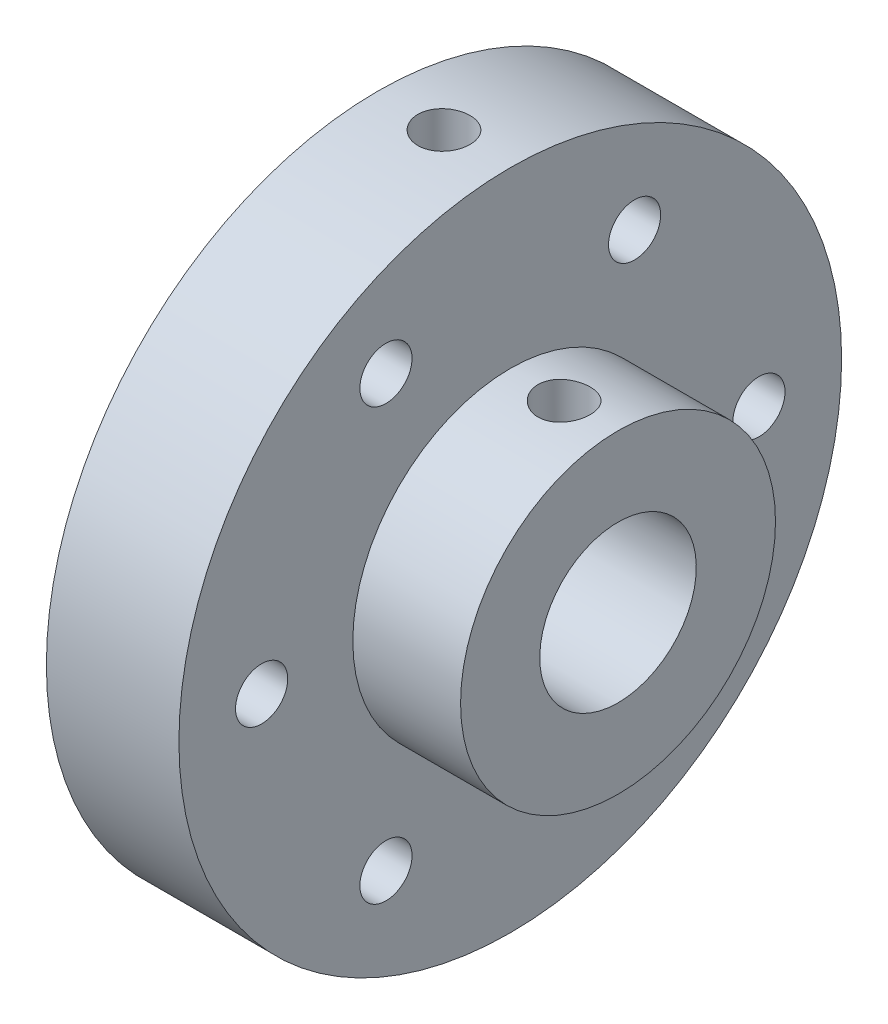
ISO-10303-21;
HEADER;
FILE_DESCRIPTION(('STEP AP214'),'2;1');
FILE_NAME('part.step','',(''),(''),'','','');
FILE_SCHEMA(('AUTOMOTIVE_DESIGN { 1 0 10303 214 1 1 1 1 }'));
ENDSEC;
DATA;
#1=APPLICATION_CONTEXT('core data for automotive mechanical design processes');
#2=APPLICATION_PROTOCOL_DEFINITION('international standard','automotive_design',2000,#1);
#3=PRODUCT_CONTEXT('',#1,'mechanical');
#4=PRODUCT('Part','Part','',(#3));
#5=PRODUCT_RELATED_PRODUCT_CATEGORY('part','',(#4));
#6=PRODUCT_DEFINITION_FORMATION('','',#4);
#7=PRODUCT_DEFINITION_CONTEXT('part definition',#1,'design');
#8=PRODUCT_DEFINITION('design','',#6,#7);
#9=PRODUCT_DEFINITION_SHAPE('','',#8);
#10=(LENGTH_UNIT() NAMED_UNIT(*) SI_UNIT(.MILLI.,.METRE.));
#11=(NAMED_UNIT(*) PLANE_ANGLE_UNIT() SI_UNIT($,.RADIAN.));
#12=(NAMED_UNIT(*) SI_UNIT($,.STERADIAN.) SOLID_ANGLE_UNIT());
#13=UNCERTAINTY_MEASURE_WITH_UNIT(LENGTH_MEASURE(1.E-05),#10,'distance_accuracy_value','');
#14=(GEOMETRIC_REPRESENTATION_CONTEXT(3) GLOBAL_UNCERTAINTY_ASSIGNED_CONTEXT((#13)) GLOBAL_UNIT_ASSIGNED_CONTEXT((#10,
#11,#12)) REPRESENTATION_CONTEXT('',''));
#15=CARTESIAN_POINT('',(0.,0.,0.));
#16=DIRECTION('',(0.,0.,1.));
#17=DIRECTION('',(1.,0.,0.));
#18=AXIS2_PLACEMENT_3D('',#15,#16,#17);
#19=CARTESIAN_POINT('',(9.21,0.,0.));
#20=DIRECTION('',(-1.,0.,0.));
#21=DIRECTION('',(0.,-1.,0.));
#22=AXIS2_PLACEMENT_3D('',#19,#20,#21);
#23=CYLINDRICAL_SURFACE('',#22,3.);
#24=CARTESIAN_POINT('',(2.54,2.82842712474619,-1.));
#25=CARTESIAN_POINT('',(2.59446817481068,2.82842694532734,-1.0000002579478));
#26=CARTESIAN_POINT('',(2.64893479977152,2.83001769372806,-0.99553478369814));
#27=CARTESIAN_POINT('',(2.75625442095062,2.8361757417458,-0.977851131702564));
#28=CARTESIAN_POINT('',(2.80910714986394,2.8407435316722,-0.964631512170673));
#29=CARTESIAN_POINT('',(2.91162689301281,2.85228203663888,-0.929955485680262));
#30=CARTESIAN_POINT('',(2.96129992944688,2.8592480396464,-0.908515221402));
#31=CARTESIAN_POINT('',(3.05636004854379,2.87479122017008,-0.858061628442627));
#32=CARTESIAN_POINT('',(3.1017461825525,2.88336875305432,-0.829046628860522));
#33=CARTESIAN_POINT('',(3.18871996233949,2.90154489405589,-0.763051146442526));
#34=CARTESIAN_POINT('',(3.23011542867204,2.91116894844139,-0.725824341377825));
#35=CARTESIAN_POINT('',(3.30620680122432,2.93013864801508,-0.644987667214489));
#36=CARTESIAN_POINT('',(3.34090163158228,2.93948424829099,-0.601376775052401));
#37=CARTESIAN_POINT('',(3.40347889732968,2.95713866921658,-0.507604507964983));
#38=CARTESIAN_POINT('',(3.43115997061798,2.96541407701568,-0.457301911224518));
#39=CARTESIAN_POINT('',(3.47759158512749,2.9796958677102,-0.35243122298748));
#40=CARTESIAN_POINT('',(3.4963445331769,2.98570286203012,-0.297864285687213));
#41=CARTESIAN_POINT('',(3.5237358546324,2.99459075431897,-0.188028817433492));
#42=CARTESIAN_POINT('',(3.53270344625701,2.99757314777558,-0.132850754852966));
#43=CARTESIAN_POINT('',(3.54131629336066,3.00043608218249,-0.0216978748240903));
#44=CARTESIAN_POINT('',(3.54096395165242,3.00031742262891,0.0342767335438936));
#45=CARTESIAN_POINT('',(3.53115574543397,2.99706039618736,0.143103515193818));
#46=CARTESIAN_POINT('',(3.52205747152549,2.99404064755135,0.195992048591668));
#47=CARTESIAN_POINT('',(3.49560701901955,2.98546967339714,0.299443438822161));
#48=CARTESIAN_POINT('',(3.47825428102024,2.97991827631115,0.350006137779176));
#49=CARTESIAN_POINT('',(3.43557868269387,2.96675670293292,0.448152474842014));
#50=CARTESIAN_POINT('',(3.41015406145322,2.9591204252427,0.495688220968998));
#51=CARTESIAN_POINT('',(3.35214029455161,2.94258393038665,0.585924325527169));
#52=CARTESIAN_POINT('',(3.31954915667336,2.93368336200518,0.628623334384769));
#53=CARTESIAN_POINT('',(3.24632560653926,2.9150619185089,0.710100866551907));
#54=CARTESIAN_POINT('',(3.20538684215456,2.90532215172667,0.748600157067556));
#55=CARTESIAN_POINT('',(3.11755127427734,2.88647335245111,0.81827725959589));
#56=CARTESIAN_POINT('',(3.07065355428676,2.8773644173145,0.849453943273005));
#57=CARTESIAN_POINT('',(2.97134637438458,2.86070525135531,0.903987455042732));
#58=CARTESIAN_POINT('',(2.91886786863219,2.85317909338821,0.927226463651049));
#59=CARTESIAN_POINT('',(2.81042860573374,2.84081650878299,0.964443193299506));
#60=CARTESIAN_POINT('',(2.75446931877818,2.83597895501223,0.978424795755529));
#61=CARTESIAN_POINT('',(2.64336164459938,2.8297963630207,0.996161282090474));
#62=CARTESIAN_POINT('',(2.58829057525427,2.82830360315139,1.00034909550575));
#63=CARTESIAN_POINT('',(2.47822385088296,2.828566720628,0.999605438911605));
#64=CARTESIAN_POINT('',(2.42322818397524,2.83032200792768,0.99467562522726));
#65=CARTESIAN_POINT('',(2.31684303428884,2.83673618089379,0.97622565155183));
#66=CARTESIAN_POINT('',(2.26539456984936,2.84129325440593,0.963006393980555));
#67=CARTESIAN_POINT('',(2.16545639376061,2.8526855367127,0.928713862560596));
#68=CARTESIAN_POINT('',(2.11696720840916,2.85952114934907,0.907639196363457));
#69=CARTESIAN_POINT('',(2.02261957915306,2.87496877595718,0.8574743407389));
#70=CARTESIAN_POINT('',(1.97689335735821,2.8836302566561,0.828151118358487));
#71=CARTESIAN_POINT('',(1.89085394761626,2.90165768730984,0.762585630557568));
#72=CARTESIAN_POINT('',(1.85054236133878,2.91102384443799,0.726341325498784));
#73=CARTESIAN_POINT('',(1.77447201590936,2.92995038637844,0.645891705900322));
#74=CARTESIAN_POINT('',(1.73902560998115,2.93949843577895,0.601387270546651));
#75=CARTESIAN_POINT('',(1.67608385765195,2.9572685161311,0.506827291400257));
#76=CARTESIAN_POINT('',(1.64858822883757,2.96549059417695,0.456771944864552));
#77=CARTESIAN_POINT('',(1.60257989513828,2.97964405810603,0.352779862432295));
#78=CARTESIAN_POINT('',(1.58400872285193,2.98559030004531,0.298871123321196));
#79=CARTESIAN_POINT('',(1.55627225793989,2.99458610837774,0.188458465846016));
#80=CARTESIAN_POINT('',(1.5471035701195,2.99763672034018,0.131955491953889));
#81=CARTESIAN_POINT('',(1.53873792239436,3.00041863236257,0.0208153358600401));
#82=CARTESIAN_POINT('',(1.53909254606762,3.00029920089441,-0.0337847239200197));
#83=CARTESIAN_POINT('',(1.54865730814641,2.99712196519396,-0.142111145000174));
#84=CARTESIAN_POINT('',(1.55786672815276,2.99406439933567,-0.195837576819056));
#85=CARTESIAN_POINT('',(1.58458223457597,2.98540914954421,-0.300042119432061));
#86=CARTESIAN_POINT('',(1.60195421535295,2.9798525836118,-0.350558270912795));
#87=CARTESIAN_POINT('',(1.64437753109714,2.96677160704464,-0.44797835093979));
#88=CARTESIAN_POINT('',(1.66943025519694,2.95924684047901,-0.49488162414241));
#89=CARTESIAN_POINT('',(1.72756951210208,2.94265868828001,-0.585634016308809));
#90=CARTESIAN_POINT('',(1.76091868538192,2.93354872492381,-0.629306251557697));
#91=CARTESIAN_POINT('',(1.83425739115591,2.91492988791425,-0.710581026272338));
#92=CARTESIAN_POINT('',(1.87424904226168,2.90542088771397,-0.748181621624259));
#93=CARTESIAN_POINT('',(1.96160935558803,2.88663279827365,-0.817741808833464));
#94=CARTESIAN_POINT('',(2.00920551098077,2.87737727995345,-0.849422965999216));
#95=CARTESIAN_POINT('',(2.10933442689865,2.86060193316303,-0.904314343299799));
#96=CARTESIAN_POINT('',(2.16186589301424,2.8530816513617,-0.927526776814559));
#97=CARTESIAN_POINT('',(2.26796182402383,2.84101334230535,-0.963843828206627));
#98=CARTESIAN_POINT('',(2.32137226356572,2.83634632944799,-0.977357909163268));
#99=CARTESIAN_POINT('',(2.42985605051547,2.83005383613939,-0.995434320161694));
#100=CARTESIAN_POINT('',(2.48492881743575,2.82842730615135,-0.999999739196502));
#101=CARTESIAN_POINT('',(2.54,2.82842712474619,-1.));
#102=B_SPLINE_CURVE_WITH_KNOTS('',3,(#24,#25,#26,#27,#28,#29,#30,#31,#32,#33,#34,#35,#36,#37,
#38,#39,#40,#41,#42,#43,#44,#45,#46,#47,#48,#49,#50,#51,#52,#53,#54,#55,#56,#57,#58,#59,#60,#61,
#62,#63,#64,#65,#66,#67,#68,#69,#70,#71,#72,#73,#74,#75,#76,#77,#78,#79,#80,#81,#82,#83,#84,#85,
#86,#87,#88,#89,#90,#91,#92,#93,#94,#95,#96,#97,#98,#99,#100,#101),.UNSPECIFIED.,.T.,.F.,(4,2,2,
2,2,2,2,2,2,2,2,2,2,2,2,2,2,2,2,2,2,2,2,2,2,2,2,2,2,2,2,2,2,2,2,2,2,2,4),(0.,0.163200584775417,
0.32642805496888,0.489336627454544,0.652281166139159,0.821013374229398,0.989772651673597,
1.16293506139029,1.33605076382161,1.50314318760306,1.67019253297699,1.83069004820941,
1.99119844184608,2.15381654855707,2.31647991869394,2.48680174359289,2.65714979607477,
2.82992639837376,3.00263051349689,3.16754291357512,3.33242535830307,3.49164395761849,
3.65089079140019,3.81518857728788,3.979534856552,4.15178808164166,4.32403518750605,
4.49513791183924,4.66617882997229,4.82918084670708,4.99216964002854,5.15256956033503,
5.31299850756315,5.47935519513707,5.64576504425704,5.81868902729217,5.99156778259939,
6.15663212153686,6.32163947179229),.UNSPECIFIED.);
#103=CARTESIAN_POINT('',(2.54,2.82842712474619,-1.));
#104=VERTEX_POINT('',#103);
#105=EDGE_CURVE('E79',#104,#104,#102,.T.);
#106=ORIENTED_EDGE('',*,*,#105,.F.);
#107=EDGE_LOOP('',(#106));
#108=FACE_BOUND('',#107,.T.);
#109=CARTESIAN_POINT('',(9.21,0.,0.));
#110=DIRECTION('',(-1.,0.,0.));
#111=DIRECTION('',(0.,-1.,0.));
#112=AXIS2_PLACEMENT_3D('',#109,#110,#111);
#113=CIRCLE('',#112,3.);
#114=CARTESIAN_POINT('',(9.21,-3.,0.));
#115=VERTEX_POINT('',#114);
#116=EDGE_CURVE('E143',#115,#115,#113,.T.);
#117=ORIENTED_EDGE('',*,*,#116,.F.);
#118=EDGE_LOOP('',(#117));
#119=FACE_BOUND('',#118,.T.);
#120=CARTESIAN_POINT('',(0.,0.,0.));
#121=DIRECTION('',(-1.,0.,0.));
#122=DIRECTION('',(0.,-1.,0.));
#123=AXIS2_PLACEMENT_3D('',#120,#121,#122);
#124=CIRCLE('',#123,3.);
#125=CARTESIAN_POINT('',(0.,-3.,0.));
#126=VERTEX_POINT('',#125);
#127=EDGE_CURVE('E62',#126,#126,#124,.T.);
#128=ORIENTED_EDGE('',*,*,#127,.T.);
#129=EDGE_LOOP('',(#128));
#130=FACE_BOUND('',#129,.T.);
#131=CARTESIAN_POINT('',(7.145,2.82842712474619,-1.));
#132=CARTESIAN_POINT('',(7.19946817481068,2.82842694532734,-1.0000002579478));
#133=CARTESIAN_POINT('',(7.25393479977153,2.83001769372806,-0.99553478369814));
#134=CARTESIAN_POINT('',(7.36125442095062,2.8361757417458,-0.977851131702563));
#135=CARTESIAN_POINT('',(7.41410714986394,2.8407435316722,-0.964631512170673));
#136=CARTESIAN_POINT('',(7.51662689301281,2.85228203663888,-0.929955485680262));
#137=CARTESIAN_POINT('',(7.56629992944688,2.8592480396464,-0.908515221401999));
#138=CARTESIAN_POINT('',(7.6613600485438,2.87479122017007,-0.858061628442626));
#139=CARTESIAN_POINT('',(7.7067461825525,2.88336875305432,-0.829046628860521));
#140=CARTESIAN_POINT('',(7.79371996233949,2.90154489405589,-0.763051146442525));
#141=CARTESIAN_POINT('',(7.83511542867204,2.91116894844139,-0.725824341377824));
#142=CARTESIAN_POINT('',(7.91120680122432,2.93013864801508,-0.644987667214489));
#143=CARTESIAN_POINT('',(7.94590163158228,2.93948424829099,-0.601376775052401));
#144=CARTESIAN_POINT('',(8.00847889732968,2.95713866921658,-0.507604507964984));
#145=CARTESIAN_POINT('',(8.03615997061798,2.96541407701568,-0.457301911224518));
#146=CARTESIAN_POINT('',(8.08259158512749,2.9796958677102,-0.35243122298748));
#147=CARTESIAN_POINT('',(8.1013445331769,2.98570286203011,-0.297864285687213));
#148=CARTESIAN_POINT('',(8.1287358546324,2.99459075431897,-0.188028817433491));
#149=CARTESIAN_POINT('',(8.13770344625701,2.99757314777558,-0.132850754852966));
#150=CARTESIAN_POINT('',(8.14631629336066,3.00043608218249,-0.0216978748240896));
#151=CARTESIAN_POINT('',(8.14596395165242,3.00031742262891,0.0342767335438942));
#152=CARTESIAN_POINT('',(8.13615574543397,2.99706039618735,0.143103515193818));
#153=CARTESIAN_POINT('',(8.12705747152549,2.99404064755135,0.195992048591668));
#154=CARTESIAN_POINT('',(8.10060701901955,2.98546967339714,0.299443438822161));
#155=CARTESIAN_POINT('',(8.08325428102025,2.97991827631115,0.350006137779176));
#156=CARTESIAN_POINT('',(8.04057868269387,2.96675670293292,0.448152474842014));
#157=CARTESIAN_POINT('',(8.01515406145322,2.95912042524269,0.495688220968998));
#158=CARTESIAN_POINT('',(7.95714029455161,2.94258393038665,0.585924325527169));
#159=CARTESIAN_POINT('',(7.92454915667336,2.93368336200518,0.628623334384769));
#160=CARTESIAN_POINT('',(7.85132560653926,2.9150619185089,0.710100866551907));
#161=CARTESIAN_POINT('',(7.81038684215456,2.90532215172667,0.748600157067556));
#162=CARTESIAN_POINT('',(7.72255127427734,2.88647335245111,0.81827725959589));
#163=CARTESIAN_POINT('',(7.67565355428676,2.8773644173145,0.849453943273005));
#164=CARTESIAN_POINT('',(7.57634637438458,2.86070525135531,0.903987455042732));
#165=CARTESIAN_POINT('',(7.52386786863219,2.85317909338821,0.927226463651049));
#166=CARTESIAN_POINT('',(7.41542860573374,2.84081650878299,0.964443193299506));
#167=CARTESIAN_POINT('',(7.35946931877818,2.83597895501223,0.978424795755529));
#168=CARTESIAN_POINT('',(7.24836164459938,2.8297963630207,0.996161282090474));
#169=CARTESIAN_POINT('',(7.19329057525428,2.82830360315139,1.00034909550575));
#170=CARTESIAN_POINT('',(7.08322385088296,2.828566720628,0.999605438911604));
#171=CARTESIAN_POINT('',(7.02822818397524,2.83032200792768,0.99467562522726));
#172=CARTESIAN_POINT('',(6.92184303428884,2.83673618089379,0.97622565155183));
#173=CARTESIAN_POINT('',(6.87039456984936,2.84129325440593,0.963006393980554));
#174=CARTESIAN_POINT('',(6.77045639376062,2.8526855367127,0.928713862560595));
#175=CARTESIAN_POINT('',(6.72196720840916,2.85952114934907,0.907639196363456));
#176=CARTESIAN_POINT('',(6.62761957915306,2.87496877595718,0.857474340738899));
#177=CARTESIAN_POINT('',(6.58189335735821,2.8836302566561,0.828151118358486));
#178=CARTESIAN_POINT('',(6.49585394761627,2.90165768730984,0.762585630557567));
#179=CARTESIAN_POINT('',(6.45554236133878,2.91102384443799,0.726341325498784));
#180=CARTESIAN_POINT('',(6.37947201590937,2.92995038637844,0.645891705900322));
#181=CARTESIAN_POINT('',(6.34402560998115,2.93949843577895,0.601387270546651));
#182=CARTESIAN_POINT('',(6.28108385765196,2.9572685161311,0.506827291400257));
#183=CARTESIAN_POINT('',(6.25358822883758,2.96549059417695,0.456771944864552));
#184=CARTESIAN_POINT('',(6.20757989513829,2.97964405810603,0.352779862432294));
#185=CARTESIAN_POINT('',(6.18900872285194,2.98559030004531,0.298871123321195));
#186=CARTESIAN_POINT('',(6.1612722579399,2.99458610837774,0.188458465846015));
#187=CARTESIAN_POINT('',(6.1521035701195,2.99763672034018,0.131955491953889));
#188=CARTESIAN_POINT('',(6.14373792239436,3.00041863236257,0.02081533586004));
#189=CARTESIAN_POINT('',(6.14409254606763,3.00029920089441,-0.0337847239200195));
#190=CARTESIAN_POINT('',(6.15365730814641,2.99712196519396,-0.142111145000174));
#191=CARTESIAN_POINT('',(6.16286672815276,2.99406439933567,-0.195837576819056));
#192=CARTESIAN_POINT('',(6.18958223457597,2.98540914954421,-0.300042119432061));
#193=CARTESIAN_POINT('',(6.20695421535295,2.97985258361179,-0.350558270912796));
#194=CARTESIAN_POINT('',(6.24937753109714,2.96677160704464,-0.44797835093979));
#195=CARTESIAN_POINT('',(6.27443025519694,2.95924684047901,-0.49488162414241));
#196=CARTESIAN_POINT('',(6.33256951210208,2.94265868828001,-0.585634016308809));
#197=CARTESIAN_POINT('',(6.36591868538192,2.93354872492381,-0.629306251557696));
#198=CARTESIAN_POINT('',(6.43925739115592,2.91492988791425,-0.710581026272338));
#199=CARTESIAN_POINT('',(6.47924904226168,2.90542088771397,-0.748181621624259));
#200=CARTESIAN_POINT('',(6.56660935558804,2.88663279827365,-0.817741808833464));
#201=CARTESIAN_POINT('',(6.61420551098077,2.87737727995345,-0.849422965999216));
#202=CARTESIAN_POINT('',(6.71433442689865,2.86060193316303,-0.904314343299799));
#203=CARTESIAN_POINT('',(6.76686589301424,2.8530816513617,-0.927526776814558));
#204=CARTESIAN_POINT('',(6.87296182402383,2.84101334230535,-0.963843828206626));
#205=CARTESIAN_POINT('',(6.92637226356572,2.83634632944799,-0.977357909163267));
#206=CARTESIAN_POINT('',(7.03485605051548,2.83005383613939,-0.995434320161694));
#207=CARTESIAN_POINT('',(7.08992881743575,2.82842730615135,-0.999999739196501));
#208=CARTESIAN_POINT('',(7.145,2.82842712474619,-1.));
#209=B_SPLINE_CURVE_WITH_KNOTS('',3,(#131,#132,#133,#134,#135,#136,#137,#138,#139,#140,#141,
#142,#143,#144,#145,#146,#147,#148,#149,#150,#151,#152,#153,#154,#155,#156,#157,#158,#159,#160,
#161,#162,#163,#164,#165,#166,#167,#168,#169,#170,#171,#172,#173,#174,#175,#176,#177,#178,#179,
#180,#181,#182,#183,#184,#185,#186,#187,#188,#189,#190,#191,#192,#193,#194,#195,#196,#197,#198,
#199,#200,#201,#202,#203,#204,#205,#206,#207,#208),.UNSPECIFIED.,.T.,.F.,(4,2,2,2,2,2,2,2,2,2,2,
2,2,2,2,2,2,2,2,2,2,2,2,2,2,2,2,2,2,2,2,2,2,2,2,2,2,2,4),(0.,0.163200584775416,
0.326428054968881,0.489336627454545,0.652281166139159,0.821013374229398,0.989772651673595,
1.16293506139029,1.33605076382161,1.50314318760306,1.67019253297699,1.83069004820941,
1.99119844184608,2.15381654855707,2.31647991869394,2.48680174359289,2.65714979607478,
2.82992639837376,3.00263051349688,3.16754291357512,3.33242535830306,3.49164395761849,
3.65089079140019,3.81518857728788,3.979534856552,4.15178808164165,4.32403518750605,
4.49513791183924,4.66617882997229,4.82918084670708,4.99216964002854,5.15256956033503,
5.31299850756315,5.47935519513706,5.64576504425704,5.81868902729217,5.99156778259939,
6.15663212153685,6.32163947179229),.UNSPECIFIED.);
#210=CARTESIAN_POINT('',(7.145,2.82842712474619,-1.));
#211=VERTEX_POINT('',#210);
#212=EDGE_CURVE('E86',#211,#211,#209,.T.);
#213=ORIENTED_EDGE('',*,*,#212,.F.);
#214=EDGE_LOOP('',(#213));
#215=FACE_BOUND('',#214,.T.);
#216=ADVANCED_FACE('F33',(#108,#119,#130,#215),#23,.F.);
#217=CARTESIAN_POINT('',(9.21,0.,0.));
#218=DIRECTION('',(1.,0.,0.));
#219=DIRECTION('',(0.,1.,0.));
#220=AXIS2_PLACEMENT_3D('',#217,#218,#219);
#221=CYLINDRICAL_SURFACE('',#220,6.035);
#222=CARTESIAN_POINT('',(9.21,0.,0.));
#223=DIRECTION('',(1.,0.,0.));
#224=DIRECTION('',(0.,1.,0.));
#225=AXIS2_PLACEMENT_3D('',#222,#223,#224);
#226=CIRCLE('',#225,6.035);
#227=CARTESIAN_POINT('',(9.21,6.035,0.));
#228=VERTEX_POINT('',#227);
#229=EDGE_CURVE('E57',#228,#228,#226,.T.);
#230=ORIENTED_EDGE('',*,*,#229,.F.);
#231=EDGE_LOOP('',(#230));
#232=FACE_BOUND('',#231,.T.);
#233=CARTESIAN_POINT('',(5.08,0.,0.));
#234=DIRECTION('',(1.,0.,0.));
#235=DIRECTION('',(0.,1.,0.));
#236=AXIS2_PLACEMENT_3D('',#233,#234,#235);
#237=CIRCLE('',#236,6.035);
#238=CARTESIAN_POINT('',(5.08,6.035,0.));
#239=VERTEX_POINT('',#238);
#240=EDGE_CURVE('E50',#239,#239,#237,.T.);
#241=ORIENTED_EDGE('',*,*,#240,.T.);
#242=EDGE_LOOP('',(#241));
#243=FACE_BOUND('',#242,.T.);
#244=CARTESIAN_POINT('',(6.145,6.035,0.));
#245=CARTESIAN_POINT('',(6.14500223991671,6.0349990477724,-0.0557611010780512));
#246=CARTESIAN_POINT('',(6.14967970494949,6.0342191301804,-0.111552750925046));
#247=CARTESIAN_POINT('',(6.1682583841932,6.03118298440473,-0.221571591999597));
#248=CARTESIAN_POINT('',(6.18216811053831,6.02892539383493,-0.275797291231119));
#249=CARTESIAN_POINT('',(6.21878007052955,6.02318715009818,-0.381076538959887));
#250=CARTESIAN_POINT('',(6.24147514489297,6.01970749302107,-0.432132631197043));
#251=CARTESIAN_POINT('',(6.29499490195382,6.01190783061853,-0.529705558548688));
#252=CARTESIAN_POINT('',(6.32581864282404,6.00758792266389,-0.57622291868809));
#253=CARTESIAN_POINT('',(6.39503078397284,5.9985410743279,-0.663844295835059));
#254=CARTESIAN_POINT('',(6.4334809850353,5.99381099916699,-0.704899177948866));
#255=CARTESIAN_POINT('',(6.51672156868362,5.98450095201309,-0.780005803175861));
#256=CARTESIAN_POINT('',(6.56151234899069,5.97992098945832,-0.814057106651412));
#257=CARTESIAN_POINT('',(6.6564997138338,5.97139936027726,-0.874386547684277));
#258=CARTESIAN_POINT('',(6.70672751197708,5.96746174409066,-0.900616162149918));
#259=CARTESIAN_POINT('',(6.81095226697019,5.96071408156926,-0.944247376496416));
#260=CARTESIAN_POINT('',(6.86494897196859,5.95790395997588,-0.961649565615174));
#261=CARTESIAN_POINT('',(6.97465818488786,5.95376063532075,-0.986977271970184));
#262=CARTESIAN_POINT('',(7.03035061129506,5.9524142269932,-0.994987573081728));
#263=CARTESIAN_POINT('',(7.14230409208344,5.95131081717702,-1.00156697949644));
#264=CARTESIAN_POINT('',(7.19856510641208,5.9515537045035,-1.00013674524611));
#265=CARTESIAN_POINT('',(7.30945386751309,5.95358938530558,-0.98794475309632));
#266=CARTESIAN_POINT('',(7.36409241311099,5.95536636719073,-0.977278188745117));
#267=CARTESIAN_POINT('',(7.47079348108611,5.96024526808725,-0.947065689652752));
#268=CARTESIAN_POINT('',(7.52285591597882,5.96334723206049,-0.927519453587787));
#269=CARTESIAN_POINT('',(7.62321216299969,5.97054368706496,-0.880005792539325));
#270=CARTESIAN_POINT('',(7.67148689028274,5.97464282469626,-0.851998790094116));
#271=CARTESIAN_POINT('',(7.76268765371023,5.98336852287122,-0.788386717328227));
#272=CARTESIAN_POINT('',(7.80561326260747,5.98799512548837,-0.752781040698116));
#273=CARTESIAN_POINT('',(7.88544835384239,5.9973239499003,-0.674463438301058));
#274=CARTESIAN_POINT('',(7.92227772387521,6.00202640389329,-0.631669827671334));
#275=CARTESIAN_POINT('',(7.98824505451445,6.01092469383245,-0.540467504180593));
#276=CARTESIAN_POINT('',(8.01738296662095,6.01512052658392,-0.492058755915046));
#277=CARTESIAN_POINT('',(8.06714736111009,6.02253867660697,-0.390925334778012));
#278=CARTESIAN_POINT('',(8.08776682073146,6.02576019004884,-0.338197143620346));
#279=CARTESIAN_POINT('',(8.11983493697612,6.03086025276245,-0.229960844036291));
#280=CARTESIAN_POINT('',(8.13128435180225,6.03273891306336,-0.174452965844873));
#281=CARTESIAN_POINT('',(8.1445788952482,6.03492667895952,-0.0629235076734708));
#282=CARTESIAN_POINT('',(8.14653401151074,6.03525375796929,-0.00691537865379712));
#283=CARTESIAN_POINT('',(8.14107761227974,6.03435071771683,0.10462822587814));
#284=CARTESIAN_POINT('',(8.13366645287475,6.03312065765414,0.160163719278331));
#285=CARTESIAN_POINT('',(8.10977935718064,6.02925267875894,0.268846272699822));
#286=CARTESIAN_POINT('',(8.09335782096762,6.02662321167043,0.322005615955606));
#287=CARTESIAN_POINT('',(8.05197407331166,6.02025009382829,0.424816693647315));
#288=CARTESIAN_POINT('',(8.02701138687457,6.01650638111027,0.474468232820398));
#289=CARTESIAN_POINT('',(7.96900165930986,6.00827555044351,0.569332380922227));
#290=CARTESIAN_POINT('',(7.93588584932903,6.00378221947229,0.61450238804799));
#291=CARTESIAN_POINT('',(7.86260457975022,5.99456947466647,0.698683290154788));
#292=CARTESIAN_POINT('',(7.82243861438188,5.98985004462943,0.737693742874537));
#293=CARTESIAN_POINT('',(7.73570412727874,5.9806589628582,0.808855417432343));
#294=CARTESIAN_POINT('',(7.68907429259113,5.97619034092643,0.840932361690237));
#295=CARTESIAN_POINT('',(7.59102350474373,5.96806324191684,0.89679786815955));
#296=CARTESIAN_POINT('',(7.53960270224106,5.96440473937616,0.920586690888405));
#297=CARTESIAN_POINT('',(7.43363814867723,5.95833479432612,0.959089343994565));
#298=CARTESIAN_POINT('',(7.37910818276733,5.95591826033085,0.973840274087948));
#299=CARTESIAN_POINT('',(7.26830116658552,5.95259304254524,0.993965244020351));
#300=CARTESIAN_POINT('',(7.21202426669609,5.95168422932944,0.999340088721423));
#301=CARTESIAN_POINT('',(7.10006250939592,5.95148288543929,1.00053806954969));
#302=CARTESIAN_POINT('',(7.04437890389233,5.95217057203009,0.996478114644539));
#303=CARTESIAN_POINT('',(6.9344987167178,5.95504140816592,0.979174401625504));
#304=CARTESIAN_POINT('',(6.88030213038744,5.95722455302453,0.96593067229138));
#305=CARTESIAN_POINT('',(6.77497885788721,5.96283283890704,0.930679930671815));
#306=CARTESIAN_POINT('',(6.72384876134282,5.96625656920668,0.908682869405972));
#307=CARTESIAN_POINT('',(6.62598581726503,5.97396164585621,0.856561867298744));
#308=CARTESIAN_POINT('',(6.57925318383477,5.97824303393192,0.826437531033435));
#309=CARTESIAN_POINT('',(6.49092087674356,5.98724379207869,0.758499407647833));
#310=CARTESIAN_POINT('',(6.44938783515346,5.99196771017673,0.72059957671205));
#311=CARTESIAN_POINT('',(6.37323089380151,6.00128488421755,0.638367753810926));
#312=CARTESIAN_POINT('',(6.33860859129393,6.00587810974397,0.594034278940304));
#313=CARTESIAN_POINT('',(6.27704046275195,6.01445262655257,0.499834573429262));
#314=CARTESIAN_POINT('',(6.2501485865402,6.0184295319696,0.449932679986198));
#315=CARTESIAN_POINT('',(6.2051704705075,6.02528061794917,0.346274483576321));
#316=CARTESIAN_POINT('',(6.18707543950922,6.02815589881488,0.292522090538369));
#317=CARTESIAN_POINT('',(6.1641429628534,6.03185056855163,0.198799040040233));
#318=CARTESIAN_POINT('',(6.15697581684408,6.03302530753154,0.159396075690563));
#319=CARTESIAN_POINT('',(6.14740357209631,6.03460035831975,0.0800006430370918));
#320=CARTESIAN_POINT('',(6.14499839287604,6.03500068321638,0.040008184707815));
#321=CARTESIAN_POINT('',(6.145,6.035,0.));
#322=B_SPLINE_CURVE_WITH_KNOTS('',3,(#244,#245,#246,#247,#248,#249,#250,#251,#252,#253,#254,
#255,#256,#257,#258,#259,#260,#261,#262,#263,#264,#265,#266,#267,#268,#269,#270,#271,#272,#273,
#274,#275,#276,#277,#278,#279,#280,#281,#282,#283,#284,#285,#286,#287,#288,#289,#290,#291,#292,
#293,#294,#295,#296,#297,#298,#299,#300,#301,#302,#303,#304,#305,#306,#307,#308,#309,#310,#311,
#312,#313,#314,#315,#316,#317,#318,#319,#320,#321),.UNSPECIFIED.,.T.,.F.,(4,2,2,2,2,2,2,2,2,2,2,
2,2,2,2,2,2,2,2,2,2,2,2,2,2,2,2,2,2,2,2,2,2,2,2,2,2,2,4),(0.,0.167137064526639,
0.334428443694447,0.501583781183245,0.668719759736498,0.837269942882293,1.0058307032497,
1.17541638486802,1.34499074501255,1.51302221476553,1.68104192939913,1.84735029833982,
2.01366431122949,2.18076867568022,2.34788637862339,2.51705064044641,2.68621596894082,
2.8555204833183,3.02481099771869,3.19213559294487,3.35945382698967,3.52577281988556,
3.69210106368931,3.85988341722512,4.02767781220493,4.1971892936543,4.36669544643163,
4.53550104696677,4.70429215617601,4.8710029036993,5.03771312879315,5.20423437225261,
5.37076371908765,5.53924625129717,5.70776767929233,5.87743813155148,6.04693867232505,
6.16686032804753,6.28677995696131),.UNSPECIFIED.);
#323=CARTESIAN_POINT('',(6.145,6.035,0.));
#324=VERTEX_POINT('',#323);
#325=EDGE_CURVE('E37',#324,#324,#322,.T.);
#326=ORIENTED_EDGE('',*,*,#325,.T.);
#327=EDGE_LOOP('',(#326));
#328=FACE_BOUND('',#327,.T.);
#329=ADVANCED_FACE('F113',(#232,#243,#328),#221,.T.);
#330=CARTESIAN_POINT('',(9.21,0.,0.));
#331=DIRECTION('',(1.,0.,0.));
#332=DIRECTION('',(0.,1.,0.));
#333=AXIS2_PLACEMENT_3D('',#330,#331,#332);
#334=CYLINDRICAL_SURFACE('',#333,12.7);
#335=CARTESIAN_POINT('',(0.,0.,0.));
#336=DIRECTION('',(1.,0.,0.));
#337=DIRECTION('',(0.,1.,0.));
#338=AXIS2_PLACEMENT_3D('',#335,#336,#337);
#339=CIRCLE('',#338,12.7);
#340=CARTESIAN_POINT('',(0.,12.7,0.));
#341=VERTEX_POINT('',#340);
#342=EDGE_CURVE('E10',#341,#341,#339,.T.);
#343=ORIENTED_EDGE('',*,*,#342,.T.);
#344=EDGE_LOOP('',(#343));
#345=FACE_BOUND('',#344,.T.);
#346=CARTESIAN_POINT('',(5.08,0.,0.));
#347=DIRECTION('',(1.,0.,0.));
#348=DIRECTION('',(0.,1.,0.));
#349=AXIS2_PLACEMENT_3D('',#346,#347,#348);
#350=CIRCLE('',#349,12.7);
#351=CARTESIAN_POINT('',(5.08,12.7,0.));
#352=VERTEX_POINT('',#351);
#353=EDGE_CURVE('E45',#352,#352,#350,.T.);
#354=ORIENTED_EDGE('',*,*,#353,.F.);
#355=EDGE_LOOP('',(#354));
#356=FACE_BOUND('',#355,.T.);
#357=CARTESIAN_POINT('',(1.54,12.7,0.));
#358=CARTESIAN_POINT('',(1.54000245399568,12.699999482304,-0.0560772490779898));
#359=CARTESIAN_POINT('',(1.54473284947429,12.6996246211498,-0.112192940483653));
#360=CARTESIAN_POINT('',(1.56353411212328,12.6981652666206,-0.22287248138477));
#361=CARTESIAN_POINT('',(1.57761563232165,12.6970799639135,-0.277434486865073));
#362=CARTESIAN_POINT('',(1.61471009175357,12.6943224032247,-0.383387599955307));
#363=CARTESIAN_POINT('',(1.63771806095789,12.6926504719129,-0.43478045365033));
#364=CARTESIAN_POINT('',(1.69200361232115,12.6889072860271,-0.532962166525474));
#365=CARTESIAN_POINT('',(1.72327939505228,12.6868361183704,-0.579752024476397));
#366=CARTESIAN_POINT('',(1.79329036466027,12.6825216607659,-0.667519355764915));
#367=CARTESIAN_POINT('',(1.83204056586565,12.6802780299311,-0.708484836635862));
#368=CARTESIAN_POINT('',(1.91586879966919,12.6758743884135,-0.783337720366913));
#369=CARTESIAN_POINT('',(1.96094710669324,12.6737143813623,-0.817224816105737));
#370=CARTESIAN_POINT('',(2.05622371645589,12.669718808807,-0.876998942986083));
#371=CARTESIAN_POINT('',(2.10642858536802,12.6678836678276,-0.902875538823547));
#372=CARTESIAN_POINT('',(2.21048736597067,12.6647493826285,-0.945827448322423));
#373=CARTESIAN_POINT('',(2.26434121940023,12.6634502298534,-0.962902902468462));
#374=CARTESIAN_POINT('',(2.37404988901919,12.661537793698,-0.987733301632478));
#375=CARTESIAN_POINT('',(2.42990028708406,12.6609230822586,-0.99550765555589));
#376=CARTESIAN_POINT('',(2.54211641241948,12.6604445822032,-1.00157511859672));
#377=CARTESIAN_POINT('',(2.59848213094367,12.6605807808658,-0.99986838833643));
#378=CARTESIAN_POINT('',(2.70999606035284,12.6615874176363,-0.98703818507478));
#379=CARTESIAN_POINT('',(2.76514671242387,12.6624562128089,-0.975935782792848));
#380=CARTESIAN_POINT('',(2.87279926701876,12.6648275681365,-0.944662114744588));
#381=CARTESIAN_POINT('',(2.92530114610501,12.6663301338983,-0.92449076874757));
#382=CARTESIAN_POINT('',(3.02623310479708,12.6698016138748,-0.875628131079415));
#383=CARTESIAN_POINT('',(3.07465857685233,12.6717710464457,-0.846927360249849));
#384=CARTESIAN_POINT('',(3.16601271822405,12.675953858523,-0.781827423255051));
#385=CARTESIAN_POINT('',(3.20894128830784,12.678167242432,-0.745428118143698));
#386=CARTESIAN_POINT('',(3.28820557499235,12.6825958612338,-0.665846054655396));
#387=CARTESIAN_POINT('',(3.32452300111321,12.6848110847254,-0.622645075692242));
#388=CARTESIAN_POINT('',(3.38939274612063,12.6889880133706,-0.530749622986983));
#389=CARTESIAN_POINT('',(3.41794506051942,12.6909497183776,-0.482055146069987));
#390=CARTESIAN_POINT('',(3.46647284853525,12.6943988904159,-0.380543259617514));
#391=CARTESIAN_POINT('',(3.48644754080127,12.6958863142409,-0.327725475000198));
#392=CARTESIAN_POINT('',(3.51724041505382,12.6982188157289,-0.219471608785023));
#393=CARTESIAN_POINT('',(3.52805876669067,12.6990639052932,-0.16403557571863));
#394=CARTESIAN_POINT('',(3.54020900020934,12.7000149897474,-0.0522774139616802));
#395=CARTESIAN_POINT('',(3.54156615195875,12.7001229534069,0.0040419513840836));
#396=CARTESIAN_POINT('',(3.53482161727188,12.6995928742386,0.116107434244945));
#397=CARTESIAN_POINT('',(3.526720009477,12.6989548376133,0.171853556522175));
#398=CARTESIAN_POINT('',(3.50130886996695,12.6970057961276,0.281118285504603));
#399=CARTESIAN_POINT('',(3.48401102208325,12.695695645263,0.334639625975011));
#400=CARTESIAN_POINT('',(3.44071034139776,12.6925496054361,0.438020125222124));
#401=CARTESIAN_POINT('',(3.41470738530918,12.690713709028,0.487879232119961));
#402=CARTESIAN_POINT('',(3.35467091092273,12.6867171900583,0.582635123748873));
#403=CARTESIAN_POINT('',(3.32062061831358,12.6845558926754,0.627521251530146));
#404=CARTESIAN_POINT('',(3.24548030969816,12.6801537640556,0.710949529535118));
#405=CARTESIAN_POINT('',(3.20439018446987,12.6779129315853,0.749491581313176));
#406=CARTESIAN_POINT('',(3.11622710552464,12.6735984881991,0.819224057291939));
#407=CARTESIAN_POINT('',(3.06914110625348,12.671525258526,0.850398014783556));
#408=CARTESIAN_POINT('',(2.97038796419194,12.6677860194195,0.904396549537766));
#409=CARTESIAN_POINT('',(2.9187208629219,12.6661200062957,0.92722120246379));
#410=CARTESIAN_POINT('',(2.81233091203683,12.6633858792234,0.963845055089452));
#411=CARTESIAN_POINT('',(2.75761157426879,12.6623170931101,0.977654404259049));
#412=CARTESIAN_POINT('',(2.64662217525716,12.6608961218393,0.995888723132016));
#413=CARTESIAN_POINT('',(2.59035214026369,12.6605439245592,1.0003138515922));
#414=CARTESIAN_POINT('',(2.47802230197733,12.6605961590035,0.999652365485097));
#415=CARTESIAN_POINT('',(2.42196234353091,12.660998532409,0.994591626499904));
#416=CARTESIAN_POINT('',(2.31149110229548,12.6625101999674,0.975155942553181));
#417=CARTESIAN_POINT('',(2.25707982215414,12.6636194952557,0.960780982634488));
#418=CARTESIAN_POINT('',(2.15144829060232,12.6664194801501,0.923131304240745));
#419=CARTESIAN_POINT('',(2.10022790041933,12.6681101444516,0.899856973115971));
#420=CARTESIAN_POINT('',(2.00241746710779,12.6718823986175,0.845072229569129));
#421=CARTESIAN_POINT('',(1.95582733981452,12.6739639813742,0.813561966890152));
#422=CARTESIAN_POINT('',(1.86846769215871,12.6782902563684,0.743102754581525));
#423=CARTESIAN_POINT('',(1.82771359183566,12.6805353579034,0.704134711559542));
#424=CARTESIAN_POINT('',(1.75330884284183,12.6849319892518,0.61989937358227));
#425=CARTESIAN_POINT('',(1.71965991989821,12.6870834962322,0.574630552694391));
#426=CARTESIAN_POINT('',(1.66038067158122,12.6910539842507,0.479000323347297));
#427=CARTESIAN_POINT('',(1.63476412196548,12.6928723918171,0.428630359841006));
#428=CARTESIAN_POINT('',(1.59238443591165,12.6959648891842,0.324324848341929));
#429=CARTESIAN_POINT('',(1.57561107545957,12.6972396072417,0.270393499399681));
#430=CARTESIAN_POINT('',(1.55568730100289,12.6987721857056,0.180117528051658));
#431=CARTESIAN_POINT('',(1.54981232979987,12.6992305322561,0.144354250657987));
#432=CARTESIAN_POINT('',(1.54196789159956,12.6998446061829,0.0723993236644045));
#433=CARTESIAN_POINT('',(1.53999841551646,12.7000003342633,0.0362076750612618));
#434=CARTESIAN_POINT('',(1.54,12.7,0.));
#435=B_SPLINE_CURVE_WITH_KNOTS('',3,(#357,#358,#359,#360,#361,#362,#363,#364,#365,#366,#367,
#368,#369,#370,#371,#372,#373,#374,#375,#376,#377,#378,#379,#380,#381,#382,#383,#384,#385,#386,
#387,#388,#389,#390,#391,#392,#393,#394,#395,#396,#397,#398,#399,#400,#401,#402,#403,#404,#405,
#406,#407,#408,#409,#410,#411,#412,#413,#414,#415,#416,#417,#418,#419,#420,#421,#422,#423,#424,
#425,#426,#427,#428,#429,#430,#431,#432,#433,#434),.UNSPECIFIED.,.T.,.F.,(4,2,2,2,2,2,2,2,2,2,2,
2,2,2,2,2,2,2,2,2,2,2,2,2,2,2,2,2,2,2,2,2,2,2,2,2,2,2,4),(0.,0.168099554143852,
0.336390940656919,0.50458876078681,0.672750004014332,0.841252628841315,1.00976256324474,
1.1784911011838,1.34721694577913,1.51559008716416,1.68396037609093,1.85195407561484,
2.01994926136649,2.18813185088285,2.35631747608264,2.52496155942592,2.69360574023526,
2.86226527988932,3.03092169452106,3.19912747246885,3.36733185194121,3.53532303651446,
3.70331660037677,3.87166347675699,4.0400129652519,4.20873520816882,4.3774559220458,
4.54598636031166,4.71451394745428,4.88258249334923,5.05065130913628,5.21871281046356,
5.38677125636254,5.55526586453213,5.72380135023214,5.89262431804064,6.06125167151063,
6.16978959543245,6.27832726684922),.UNSPECIFIED.);
#436=CARTESIAN_POINT('',(1.54,12.7,0.));
#437=VERTEX_POINT('',#436);
#438=EDGE_CURVE('E85',#437,#437,#435,.T.);
#439=ORIENTED_EDGE('',*,*,#438,.T.);
#440=EDGE_LOOP('',(#439));
#441=FACE_BOUND('',#440,.T.);
#442=ADVANCED_FACE('F109',(#345,#356,#441),#334,.T.);
#443=CARTESIAN_POINT('',(0.,0.,0.));
#444=DIRECTION('',(-1.,0.,0.));
#445=DIRECTION('',(0.,-1.,0.));
#446=AXIS2_PLACEMENT_3D('',#443,#444,#445);
#447=PLANE('',#446);
#448=CARTESIAN_POINT('',(0.,8.25322209806564,4.7650000000001));
#449=DIRECTION('',(-1.,0.,0.));
#450=DIRECTION('',(0.,-1.,0.));
#451=AXIS2_PLACEMENT_3D('',#448,#449,#450);
#452=CIRCLE('',#451,0.999999999999999);
#453=CARTESIAN_POINT('',(0.,7.25322209806564,4.7650000000001));
#454=VERTEX_POINT('',#453);
#455=EDGE_CURVE('E78',#454,#454,#452,.T.);
#456=ORIENTED_EDGE('',*,*,#455,.F.);
#457=EDGE_LOOP('',(#456));
#458=FACE_BOUND('',#457,.T.);
#459=CARTESIAN_POINT('',(0.,8.25322209806574,-4.76499999999992));
#460=DIRECTION('',(-1.,0.,0.));
#461=DIRECTION('',(0.,-1.,0.));
#462=AXIS2_PLACEMENT_3D('',#459,#460,#461);
#463=CIRCLE('',#462,1.);
#464=CARTESIAN_POINT('',(0.,7.25322209806574,-4.76499999999992));
#465=VERTEX_POINT('',#464);
#466=EDGE_CURVE('E75',#465,#465,#463,.T.);
#467=ORIENTED_EDGE('',*,*,#466,.F.);
#468=EDGE_LOOP('',(#467));
#469=FACE_BOUND('',#468,.T.);
#470=CARTESIAN_POINT('',(0.,0.,-9.53));
#471=DIRECTION('',(-1.,0.,0.));
#472=DIRECTION('',(0.,-1.,0.));
#473=AXIS2_PLACEMENT_3D('',#470,#471,#472);
#474=CIRCLE('',#473,0.999999999999999);
#475=CARTESIAN_POINT('',(0.,-0.999999999999933,-9.53));
#476=VERTEX_POINT('',#475);
#477=EDGE_CURVE('E71',#476,#476,#474,.T.);
#478=ORIENTED_EDGE('',*,*,#477,.F.);
#479=EDGE_LOOP('',(#478));
#480=FACE_BOUND('',#479,.T.);
#481=CARTESIAN_POINT('',(0.,-8.25322209806568,-4.76500000000004));
#482=DIRECTION('',(-1.,0.,0.));
#483=DIRECTION('',(0.,-1.,0.));
#484=AXIS2_PLACEMENT_3D('',#481,#482,#483);
#485=CIRCLE('',#484,0.999999999999999);
#486=CARTESIAN_POINT('',(0.,-9.25322209806568,-4.76500000000004));
#487=VERTEX_POINT('',#486);
#488=EDGE_CURVE('E67',#487,#487,#485,.T.);
#489=ORIENTED_EDGE('',*,*,#488,.F.);
#490=EDGE_LOOP('',(#489));
#491=FACE_BOUND('',#490,.T.);
#492=CARTESIAN_POINT('',(0.,-8.25322209806571,4.76499999999998));
#493=DIRECTION('',(-1.,0.,0.));
#494=DIRECTION('',(0.,-1.,0.));
#495=AXIS2_PLACEMENT_3D('',#492,#493,#494);
#496=CIRCLE('',#495,1.);
#497=CARTESIAN_POINT('',(0.,-9.25322209806571,4.76499999999998));
#498=VERTEX_POINT('',#497);
#499=EDGE_CURVE('E63',#498,#498,#496,.T.);
#500=ORIENTED_EDGE('',*,*,#499,.F.);
#501=EDGE_LOOP('',(#500));
#502=FACE_BOUND('',#501,.T.);
#503=ORIENTED_EDGE('',*,*,#127,.F.);
#504=EDGE_LOOP('',(#503));
#505=FACE_BOUND('',#504,.T.);
#506=CARTESIAN_POINT('',(0.,0.,9.53));
#507=DIRECTION('',(-1.,0.,0.));
#508=DIRECTION('',(0.,-1.,0.));
#509=AXIS2_PLACEMENT_3D('',#506,#507,#508);
#510=CIRCLE('',#509,1.);
#511=CARTESIAN_POINT('',(0.,-1.,9.53));
#512=VERTEX_POINT('',#511);
#513=EDGE_CURVE('E58',#512,#512,#510,.T.);
#514=ORIENTED_EDGE('',*,*,#513,.F.);
#515=EDGE_LOOP('',(#514));
#516=FACE_BOUND('',#515,.T.);
#517=ORIENTED_EDGE('',*,*,#342,.F.);
#518=EDGE_LOOP('',(#517));
#519=FACE_BOUND('',#518,.T.);
#520=ADVANCED_FACE('F35',(#458,#469,#480,#491,#502,#505,#516,#519),#447,.T.);
#521=CARTESIAN_POINT('',(5.08,12.7,0.));
#522=DIRECTION('',(1.,0.,0.));
#523=DIRECTION('',(0.,1.,0.));
#524=AXIS2_PLACEMENT_3D('',#521,#522,#523);
#525=PLANE('',#524);
#526=CARTESIAN_POINT('',(5.08,8.25322209806564,4.7650000000001));
#527=DIRECTION('',(1.,0.,0.));
#528=DIRECTION('',(0.,1.,0.));
#529=AXIS2_PLACEMENT_3D('',#526,#527,#528);
#530=CIRCLE('',#529,0.999999999999999);
#531=CARTESIAN_POINT('',(5.08,9.25322209806564,4.7650000000001));
#532=VERTEX_POINT('',#531);
#533=EDGE_CURVE('E76',#532,#532,#530,.T.);
#534=ORIENTED_EDGE('',*,*,#533,.F.);
#535=EDGE_LOOP('',(#534));
#536=FACE_BOUND('',#535,.T.);
#537=CARTESIAN_POINT('',(5.08,8.25322209806574,-4.76499999999992));
#538=DIRECTION('',(1.,0.,0.));
#539=DIRECTION('',(0.,1.,0.));
#540=AXIS2_PLACEMENT_3D('',#537,#538,#539);
#541=CIRCLE('',#540,1.);
#542=CARTESIAN_POINT('',(5.08,9.25322209806574,-4.76499999999992));
#543=VERTEX_POINT('',#542);
#544=EDGE_CURVE('E72',#543,#543,#541,.T.);
#545=ORIENTED_EDGE('',*,*,#544,.F.);
#546=EDGE_LOOP('',(#545));
#547=FACE_BOUND('',#546,.T.);
#548=CARTESIAN_POINT('',(5.08,0.,-9.53));
#549=DIRECTION('',(1.,0.,0.));
#550=DIRECTION('',(0.,1.,0.));
#551=AXIS2_PLACEMENT_3D('',#548,#549,#550);
#552=CIRCLE('',#551,0.999999999999999);
#553=CARTESIAN_POINT('',(5.08,1.00000000000007,-9.53));
#554=VERTEX_POINT('',#553);
#555=EDGE_CURVE('E68',#554,#554,#552,.T.);
#556=ORIENTED_EDGE('',*,*,#555,.F.);
#557=EDGE_LOOP('',(#556));
#558=FACE_BOUND('',#557,.T.);
#559=CARTESIAN_POINT('',(5.08,-8.25322209806568,-4.76500000000004));
#560=DIRECTION('',(1.,0.,0.));
#561=DIRECTION('',(0.,1.,0.));
#562=AXIS2_PLACEMENT_3D('',#559,#560,#561);
#563=CIRCLE('',#562,0.999999999999999);
#564=CARTESIAN_POINT('',(5.08,-7.25322209806568,-4.76500000000004));
#565=VERTEX_POINT('',#564);
#566=EDGE_CURVE('E64',#565,#565,#563,.T.);
#567=ORIENTED_EDGE('',*,*,#566,.F.);
#568=EDGE_LOOP('',(#567));
#569=FACE_BOUND('',#568,.T.);
#570=CARTESIAN_POINT('',(5.08,-8.25322209806571,4.76499999999998));
#571=DIRECTION('',(1.,0.,0.));
#572=DIRECTION('',(0.,1.,0.));
#573=AXIS2_PLACEMENT_3D('',#570,#571,#572);
#574=CIRCLE('',#573,1.);
#575=CARTESIAN_POINT('',(5.08,-7.25322209806571,4.76499999999998));
#576=VERTEX_POINT('',#575);
#577=EDGE_CURVE('E59',#576,#576,#574,.T.);
#578=ORIENTED_EDGE('',*,*,#577,.F.);
#579=EDGE_LOOP('',(#578));
#580=FACE_BOUND('',#579,.T.);
#581=CARTESIAN_POINT('',(5.08,0.,9.53));
#582=DIRECTION('',(1.,0.,0.));
#583=DIRECTION('',(0.,1.,0.));
#584=AXIS2_PLACEMENT_3D('',#581,#582,#583);
#585=CIRCLE('',#584,1.);
#586=CARTESIAN_POINT('',(5.08,0.999999999999999,9.53));
#587=VERTEX_POINT('',#586);
#588=EDGE_CURVE('E54',#587,#587,#585,.T.);
#589=ORIENTED_EDGE('',*,*,#588,.F.);
#590=EDGE_LOOP('',(#589));
#591=FACE_BOUND('',#590,.T.);
#592=ORIENTED_EDGE('',*,*,#353,.T.);
#593=EDGE_LOOP('',(#592));
#594=FACE_BOUND('',#593,.T.);
#595=ORIENTED_EDGE('',*,*,#240,.F.);
#596=EDGE_LOOP('',(#595));
#597=FACE_BOUND('',#596,.T.);
#598=ADVANCED_FACE('F114',(#536,#547,#558,#569,#580,#591,#594,#597),#525,.T.);
#599=CARTESIAN_POINT('',(9.21,6.035,0.));
#600=DIRECTION('',(1.,0.,0.));
#601=DIRECTION('',(0.,1.,0.));
#602=AXIS2_PLACEMENT_3D('',#599,#600,#601);
#603=PLANE('',#602);
#604=ORIENTED_EDGE('',*,*,#116,.T.);
#605=EDGE_LOOP('',(#604));
#606=FACE_BOUND('',#605,.T.);
#607=ORIENTED_EDGE('',*,*,#229,.T.);
#608=EDGE_LOOP('',(#607));
#609=FACE_BOUND('',#608,.T.);
#610=ADVANCED_FACE('F116',(#606,#609),#603,.T.);
#611=CARTESIAN_POINT('',(9.21,0.,9.53));
#612=DIRECTION('',(-1.,0.,0.));
#613=DIRECTION('',(0.,-1.,0.));
#614=AXIS2_PLACEMENT_3D('',#611,#612,#613);
#615=CYLINDRICAL_SURFACE('',#614,1.);
#616=ORIENTED_EDGE('',*,*,#588,.T.);
#617=EDGE_LOOP('',(#616));
#618=FACE_BOUND('',#617,.T.);
#619=ORIENTED_EDGE('',*,*,#513,.T.);
#620=EDGE_LOOP('',(#619));
#621=FACE_BOUND('',#620,.T.);
#622=ADVANCED_FACE('F123',(#618,#621),#615,.F.);
#623=CARTESIAN_POINT('',(9.21,-8.25322209806571,4.76499999999998));
#624=DIRECTION('',(-1.,0.,0.));
#625=DIRECTION('',(0.,-1.,0.));
#626=AXIS2_PLACEMENT_3D('',#623,#624,#625);
#627=CYLINDRICAL_SURFACE('',#626,1.);
#628=ORIENTED_EDGE('',*,*,#577,.T.);
#629=EDGE_LOOP('',(#628));
#630=FACE_BOUND('',#629,.T.);
#631=ORIENTED_EDGE('',*,*,#499,.T.);
#632=EDGE_LOOP('',(#631));
#633=FACE_BOUND('',#632,.T.);
#634=ADVANCED_FACE('F126',(#630,#633),#627,.F.);
#635=CARTESIAN_POINT('',(9.21,-8.25322209806568,-4.76500000000004));
#636=DIRECTION('',(-1.,0.,0.));
#637=DIRECTION('',(0.,-1.,0.));
#638=AXIS2_PLACEMENT_3D('',#635,#636,#637);
#639=CYLINDRICAL_SURFACE('',#638,0.999999999999999);
#640=ORIENTED_EDGE('',*,*,#566,.T.);
#641=EDGE_LOOP('',(#640));
#642=FACE_BOUND('',#641,.T.);
#643=ORIENTED_EDGE('',*,*,#488,.T.);
#644=EDGE_LOOP('',(#643));
#645=FACE_BOUND('',#644,.T.);
#646=ADVANCED_FACE('F131',(#642,#645),#639,.F.);
#647=CARTESIAN_POINT('',(9.21,0.,-9.53));
#648=DIRECTION('',(-1.,0.,0.));
#649=DIRECTION('',(0.,-1.,0.));
#650=AXIS2_PLACEMENT_3D('',#647,#648,#649);
#651=CYLINDRICAL_SURFACE('',#650,0.999999999999999);
#652=ORIENTED_EDGE('',*,*,#555,.T.);
#653=EDGE_LOOP('',(#652));
#654=FACE_BOUND('',#653,.T.);
#655=ORIENTED_EDGE('',*,*,#477,.T.);
#656=EDGE_LOOP('',(#655));
#657=FACE_BOUND('',#656,.T.);
#658=ADVANCED_FACE('F175',(#654,#657),#651,.F.);
#659=CARTESIAN_POINT('',(9.21,8.25322209806574,-4.76499999999992));
#660=DIRECTION('',(-1.,0.,0.));
#661=DIRECTION('',(0.,-1.,0.));
#662=AXIS2_PLACEMENT_3D('',#659,#660,#661);
#663=CYLINDRICAL_SURFACE('',#662,1.);
#664=ORIENTED_EDGE('',*,*,#544,.T.);
#665=EDGE_LOOP('',(#664));
#666=FACE_BOUND('',#665,.T.);
#667=ORIENTED_EDGE('',*,*,#466,.T.);
#668=EDGE_LOOP('',(#667));
#669=FACE_BOUND('',#668,.T.);
#670=ADVANCED_FACE('F168',(#666,#669),#663,.F.);
#671=CARTESIAN_POINT('',(9.21,8.25322209806564,4.7650000000001));
#672=DIRECTION('',(-1.,0.,0.));
#673=DIRECTION('',(0.,-1.,0.));
#674=AXIS2_PLACEMENT_3D('',#671,#672,#673);
#675=CYLINDRICAL_SURFACE('',#674,0.999999999999999);
#676=ORIENTED_EDGE('',*,*,#533,.T.);
#677=EDGE_LOOP('',(#676));
#678=FACE_BOUND('',#677,.T.);
#679=ORIENTED_EDGE('',*,*,#455,.T.);
#680=EDGE_LOOP('',(#679));
#681=FACE_BOUND('',#680,.T.);
#682=ADVANCED_FACE('F95',(#678,#681),#675,.F.);
#683=CARTESIAN_POINT('',(2.54,12.7,0.));
#684=DIRECTION('',(0.,-1.,0.));
#685=DIRECTION('',(0.,0.,-1.));
#686=AXIS2_PLACEMENT_3D('',#683,#684,#685);
#687=CYLINDRICAL_SURFACE('',#686,1.);
#688=ORIENTED_EDGE('',*,*,#438,.F.);
#689=EDGE_LOOP('',(#688));
#690=FACE_BOUND('',#689,.T.);
#691=ORIENTED_EDGE('',*,*,#105,.T.);
#692=EDGE_LOOP('',(#691));
#693=FACE_BOUND('',#692,.T.);
#694=ADVANCED_FACE('F90',(#690,#693),#687,.F.);
#695=CARTESIAN_POINT('',(7.145,12.7,0.));
#696=DIRECTION('',(0.,-1.,0.));
#697=DIRECTION('',(0.,0.,-1.));
#698=AXIS2_PLACEMENT_3D('',#695,#696,#697);
#699=CYLINDRICAL_SURFACE('',#698,1.);
#700=ORIENTED_EDGE('',*,*,#325,.F.);
#701=EDGE_LOOP('',(#700));
#702=FACE_BOUND('',#701,.T.);
#703=ORIENTED_EDGE('',*,*,#212,.T.);
#704=EDGE_LOOP('',(#703));
#705=FACE_BOUND('',#704,.T.);
#706=ADVANCED_FACE('F94',(#702,#705),#699,.F.);
#707=CLOSED_SHELL('',(#216,#329,#442,#520,#598,#610,#622,#634,#646,#658,#670,#682,#694,#706));
#708=MANIFOLD_SOLID_BREP('B2',#707);
#709=ADVANCED_BREP_SHAPE_REPRESENTATION('',(#18,#708),#14);
#710=SHAPE_DEFINITION_REPRESENTATION(#9,#709);
ENDSEC;
END-ISO-10303-21;
